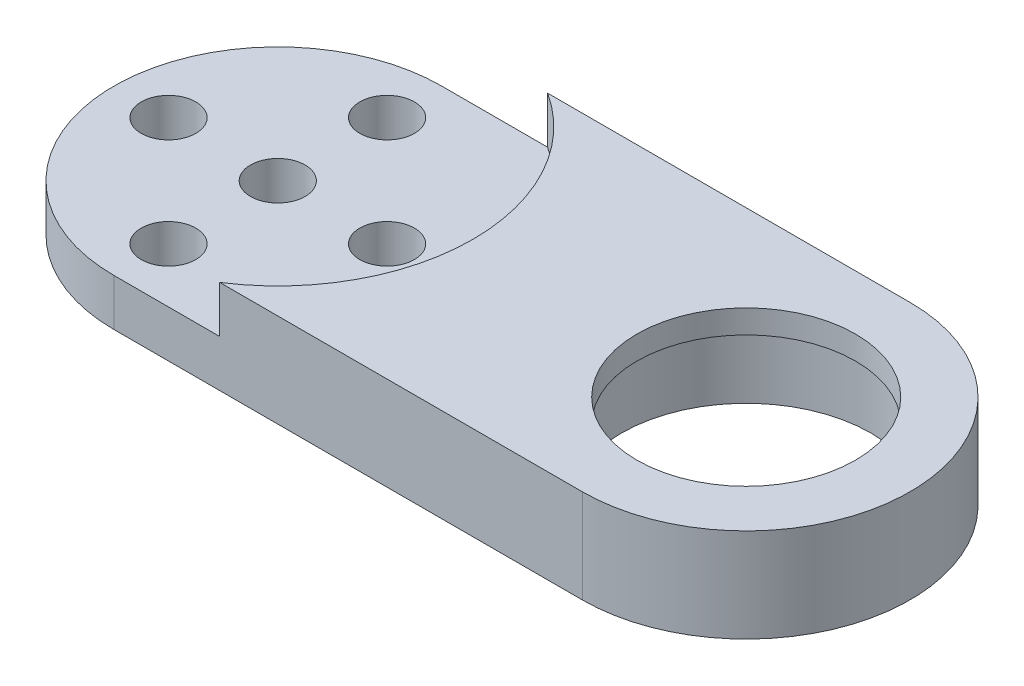
ISO-10303-21;
HEADER;
FILE_DESCRIPTION(('STEP AP214'),'2;1');
FILE_NAME('part.step','',(''),(''),'','','');
FILE_SCHEMA(('AUTOMOTIVE_DESIGN { 1 0 10303 214 1 1 1 1 }'));
ENDSEC;
DATA;
#1=APPLICATION_CONTEXT('core data for automotive mechanical design processes');
#2=APPLICATION_PROTOCOL_DEFINITION('international standard','automotive_design',2000,#1);
#3=PRODUCT_CONTEXT('',#1,'mechanical');
#4=PRODUCT('Part','Part','',(#3));
#5=PRODUCT_RELATED_PRODUCT_CATEGORY('part','',(#4));
#6=PRODUCT_DEFINITION_FORMATION('','',#4);
#7=PRODUCT_DEFINITION_CONTEXT('part definition',#1,'design');
#8=PRODUCT_DEFINITION('design','',#6,#7);
#9=PRODUCT_DEFINITION_SHAPE('','',#8);
#10=(LENGTH_UNIT() NAMED_UNIT(*) SI_UNIT(.MILLI.,.METRE.));
#11=(NAMED_UNIT(*) PLANE_ANGLE_UNIT() SI_UNIT($,.RADIAN.));
#12=(NAMED_UNIT(*) SI_UNIT($,.STERADIAN.) SOLID_ANGLE_UNIT());
#13=UNCERTAINTY_MEASURE_WITH_UNIT(LENGTH_MEASURE(1.E-05),#10,'distance_accuracy_value','');
#14=(GEOMETRIC_REPRESENTATION_CONTEXT(3) GLOBAL_UNCERTAINTY_ASSIGNED_CONTEXT((#13)) GLOBAL_UNIT_ASSIGNED_CONTEXT((#10,
#11,#12)) REPRESENTATION_CONTEXT('',''));
#15=CARTESIAN_POINT('',(0.,0.,0.));
#16=DIRECTION('',(0.,0.,1.));
#17=DIRECTION('',(1.,0.,0.));
#18=AXIS2_PLACEMENT_3D('',#15,#16,#17);
#19=CARTESIAN_POINT('',(-15.,6.,0.));
#20=DIRECTION('',(0.,-1.,0.));
#21=DIRECTION('',(0.,0.,-1.));
#22=AXIS2_PLACEMENT_3D('',#19,#20,#21);
#23=CYLINDRICAL_SURFACE('',#22,10.5);
#24=CARTESIAN_POINT('',(-15.,3.,0.));
#25=DIRECTION('',(0.,1.,0.));
#26=DIRECTION('',(0.,0.,1.));
#27=AXIS2_PLACEMENT_3D('',#24,#25,#26);
#28=CIRCLE('',#27,10.5);
#29=CARTESIAN_POINT('',(-15.,3.,-10.5));
#30=VERTEX_POINT('',#29);
#31=CARTESIAN_POINT('',(-15.,3.,10.5));
#32=VERTEX_POINT('',#31);
#33=EDGE_CURVE('E135',#30,#32,#28,.T.);
#34=ORIENTED_EDGE('',*,*,#33,.F.);
#35=DIRECTION('',(0.,-1.,0.));
#36=VECTOR('',#35,1.);
#37=CARTESIAN_POINT('',(-15.,6.,-10.5));
#38=LINE('',#37,#36);
#39=CARTESIAN_POINT('',(-15.,0.,-10.5));
#40=VERTEX_POINT('',#39);
#41=EDGE_CURVE('E55',#30,#40,#38,.T.);
#42=ORIENTED_EDGE('',*,*,#41,.T.);
#43=CARTESIAN_POINT('',(-15.,0.,0.));
#44=DIRECTION('',(0.,1.,0.));
#45=DIRECTION('',(0.,0.,1.));
#46=AXIS2_PLACEMENT_3D('',#43,#44,#45);
#47=CIRCLE('',#46,10.5);
#48=CARTESIAN_POINT('',(-15.,0.,10.5));
#49=VERTEX_POINT('',#48);
#50=EDGE_CURVE('E103',#40,#49,#47,.T.);
#51=ORIENTED_EDGE('',*,*,#50,.T.);
#52=DIRECTION('',(0.,-1.,0.));
#53=VECTOR('',#52,1.);
#54=CARTESIAN_POINT('',(-15.,6.,10.5));
#55=LINE('',#54,#53);
#56=EDGE_CURVE('E96',#32,#49,#55,.T.);
#57=ORIENTED_EDGE('',*,*,#56,.F.);
#58=EDGE_LOOP('',(#34,#42,#51,#57));
#59=FACE_BOUND('',#58,.T.);
#60=ADVANCED_FACE('F45',(#59),#23,.T.);
#61=CARTESIAN_POINT('',(-15.,0.,0.));
#62=DIRECTION('',(0.,1.,0.));
#63=DIRECTION('',(0.,0.,1.));
#64=AXIS2_PLACEMENT_3D('',#61,#62,#63);
#65=CYLINDRICAL_SURFACE('',#64,1.75);
#66=CARTESIAN_POINT('',(-15.,0.,0.));
#67=DIRECTION('',(0.,1.,0.));
#68=DIRECTION('',(0.,0.,1.));
#69=AXIS2_PLACEMENT_3D('',#66,#67,#68);
#70=CIRCLE('',#69,1.75);
#71=CARTESIAN_POINT('',(-15.,0.,1.75));
#72=VERTEX_POINT('',#71);
#73=EDGE_CURVE('E115',#72,#72,#70,.T.);
#74=ORIENTED_EDGE('',*,*,#73,.F.);
#75=EDGE_LOOP('',(#74));
#76=FACE_BOUND('',#75,.T.);
#77=CARTESIAN_POINT('',(-15.,3.,0.));
#78=DIRECTION('',(0.,1.,0.));
#79=DIRECTION('',(0.,0.,1.));
#80=AXIS2_PLACEMENT_3D('',#77,#78,#79);
#81=CIRCLE('',#80,1.75);
#82=CARTESIAN_POINT('',(-15.,3.,1.75));
#83=VERTEX_POINT('',#82);
#84=EDGE_CURVE('E187',#83,#83,#81,.F.);
#85=ORIENTED_EDGE('',*,*,#84,.F.);
#86=EDGE_LOOP('',(#85));
#87=FACE_BOUND('',#86,.T.);
#88=ADVANCED_FACE('F253',(#76,#87),#65,.F.);
#89=CARTESIAN_POINT('',(-15.,0.,-6.99999999999999));
#90=DIRECTION('',(0.,1.,0.));
#91=DIRECTION('',(0.,0.,1.));
#92=AXIS2_PLACEMENT_3D('',#89,#90,#91);
#93=CYLINDRICAL_SURFACE('',#92,1.75);
#94=CARTESIAN_POINT('',(-15.,0.,-6.99999999999999));
#95=DIRECTION('',(0.,1.,0.));
#96=DIRECTION('',(0.,0.,1.));
#97=AXIS2_PLACEMENT_3D('',#94,#95,#96);
#98=CIRCLE('',#97,1.75);
#99=CARTESIAN_POINT('',(-15.,0.,-5.24999999999999));
#100=VERTEX_POINT('',#99);
#101=EDGE_CURVE('E158',#100,#100,#98,.T.);
#102=ORIENTED_EDGE('',*,*,#101,.F.);
#103=EDGE_LOOP('',(#102));
#104=FACE_BOUND('',#103,.T.);
#105=CARTESIAN_POINT('',(-15.,3.,-6.99999999999999));
#106=DIRECTION('',(0.,1.,0.));
#107=DIRECTION('',(0.,0.,1.));
#108=AXIS2_PLACEMENT_3D('',#105,#106,#107);
#109=CIRCLE('',#108,1.75);
#110=CARTESIAN_POINT('',(-15.,3.,-5.24999999999999));
#111=VERTEX_POINT('',#110);
#112=EDGE_CURVE('E191',#111,#111,#109,.F.);
#113=ORIENTED_EDGE('',*,*,#112,.F.);
#114=EDGE_LOOP('',(#113));
#115=FACE_BOUND('',#114,.T.);
#116=ADVANCED_FACE('F256',(#104,#115),#93,.F.);
#117=CARTESIAN_POINT('',(-22.,0.,0.));
#118=DIRECTION('',(0.,1.,0.));
#119=DIRECTION('',(0.,0.,1.));
#120=AXIS2_PLACEMENT_3D('',#117,#118,#119);
#121=CYLINDRICAL_SURFACE('',#120,1.75);
#122=CARTESIAN_POINT('',(-22.,0.,0.));
#123=DIRECTION('',(0.,1.,0.));
#124=DIRECTION('',(0.,0.,1.));
#125=AXIS2_PLACEMENT_3D('',#122,#123,#124);
#126=CIRCLE('',#125,1.75);
#127=CARTESIAN_POINT('',(-22.,0.,1.75000000000002));
#128=VERTEX_POINT('',#127);
#129=EDGE_CURVE('E154',#128,#128,#126,.T.);
#130=ORIENTED_EDGE('',*,*,#129,.F.);
#131=EDGE_LOOP('',(#130));
#132=FACE_BOUND('',#131,.T.);
#133=CARTESIAN_POINT('',(-22.,3.,0.));
#134=DIRECTION('',(0.,1.,0.));
#135=DIRECTION('',(0.,0.,1.));
#136=AXIS2_PLACEMENT_3D('',#133,#134,#135);
#137=CIRCLE('',#136,1.75);
#138=CARTESIAN_POINT('',(-22.,3.,1.75000000000002));
#139=VERTEX_POINT('',#138);
#140=EDGE_CURVE('E195',#139,#139,#137,.F.);
#141=ORIENTED_EDGE('',*,*,#140,.F.);
#142=EDGE_LOOP('',(#141));
#143=FACE_BOUND('',#142,.T.);
#144=ADVANCED_FACE('F304',(#132,#143),#121,.F.);
#145=CARTESIAN_POINT('',(-15.,0.,7.));
#146=DIRECTION('',(0.,1.,0.));
#147=DIRECTION('',(0.,0.,1.));
#148=AXIS2_PLACEMENT_3D('',#145,#146,#147);
#149=CYLINDRICAL_SURFACE('',#148,1.75);
#150=CARTESIAN_POINT('',(-15.,0.,7.));
#151=DIRECTION('',(0.,1.,0.));
#152=DIRECTION('',(0.,0.,1.));
#153=AXIS2_PLACEMENT_3D('',#150,#151,#152);
#154=CIRCLE('',#153,1.75);
#155=CARTESIAN_POINT('',(-15.,0.,8.75));
#156=VERTEX_POINT('',#155);
#157=EDGE_CURVE('E150',#156,#156,#154,.T.);
#158=ORIENTED_EDGE('',*,*,#157,.F.);
#159=EDGE_LOOP('',(#158));
#160=FACE_BOUND('',#159,.T.);
#161=CARTESIAN_POINT('',(-15.,3.,7.));
#162=DIRECTION('',(0.,1.,0.));
#163=DIRECTION('',(0.,0.,1.));
#164=AXIS2_PLACEMENT_3D('',#161,#162,#163);
#165=CIRCLE('',#164,1.75);
#166=CARTESIAN_POINT('',(-15.,3.,8.75));
#167=VERTEX_POINT('',#166);
#168=EDGE_CURVE('E199',#167,#167,#165,.F.);
#169=ORIENTED_EDGE('',*,*,#168,.F.);
#170=EDGE_LOOP('',(#169));
#171=FACE_BOUND('',#170,.T.);
#172=ADVANCED_FACE('F298',(#160,#171),#149,.F.);
#173=CARTESIAN_POINT('',(-8.,0.,0.));
#174=DIRECTION('',(0.,1.,0.));
#175=DIRECTION('',(0.,0.,1.));
#176=AXIS2_PLACEMENT_3D('',#173,#174,#175);
#177=CYLINDRICAL_SURFACE('',#176,1.75);
#178=CARTESIAN_POINT('',(-8.,0.,0.));
#179=DIRECTION('',(0.,1.,0.));
#180=DIRECTION('',(0.,0.,1.));
#181=AXIS2_PLACEMENT_3D('',#178,#179,#180);
#182=CIRCLE('',#181,1.75);
#183=CARTESIAN_POINT('',(-8.,0.,1.74999999999999));
#184=VERTEX_POINT('',#183);
#185=EDGE_CURVE('E121',#184,#184,#182,.T.);
#186=ORIENTED_EDGE('',*,*,#185,.F.);
#187=EDGE_LOOP('',(#186));
#188=FACE_BOUND('',#187,.T.);
#189=CARTESIAN_POINT('',(-8.,3.,0.));
#190=DIRECTION('',(0.,1.,0.));
#191=DIRECTION('',(0.,0.,1.));
#192=AXIS2_PLACEMENT_3D('',#189,#190,#191);
#193=CIRCLE('',#192,1.75);
#194=CARTESIAN_POINT('',(-8.,3.,1.74999999999999));
#195=VERTEX_POINT('',#194);
#196=EDGE_CURVE('E49',#195,#195,#193,.F.);
#197=ORIENTED_EDGE('',*,*,#196,.F.);
#198=EDGE_LOOP('',(#197));
#199=FACE_BOUND('',#198,.T.);
#200=ADVANCED_FACE('F295',(#188,#199),#177,.F.);
#201=CARTESIAN_POINT('',(15.,6.,0.));
#202=DIRECTION('',(0.,-1.,0.));
#203=DIRECTION('',(0.,0.,-1.));
#204=AXIS2_PLACEMENT_3D('',#201,#202,#203);
#205=CYLINDRICAL_SURFACE('',#204,10.5);
#206=CARTESIAN_POINT('',(15.,0.,0.));
#207=DIRECTION('',(0.,1.,0.));
#208=DIRECTION('',(0.,0.,-1.));
#209=AXIS2_PLACEMENT_3D('',#206,#207,#208);
#210=CIRCLE('',#209,10.5);
#211=CARTESIAN_POINT('',(15.,0.,10.5));
#212=VERTEX_POINT('',#211);
#213=CARTESIAN_POINT('',(15.,0.,-10.5));
#214=VERTEX_POINT('',#213);
#215=EDGE_CURVE('E108',#212,#214,#210,.T.);
#216=ORIENTED_EDGE('',*,*,#215,.T.);
#217=DIRECTION('',(0.,-1.,0.));
#218=VECTOR('',#217,1.);
#219=CARTESIAN_POINT('',(15.,6.,-10.5));
#220=LINE('',#219,#218);
#221=CARTESIAN_POINT('',(15.,6.,-10.5));
#222=VERTEX_POINT('',#221);
#223=EDGE_CURVE('E11',#222,#214,#220,.T.);
#224=ORIENTED_EDGE('',*,*,#223,.F.);
#225=CARTESIAN_POINT('',(15.,6.,0.));
#226=DIRECTION('',(0.,1.,0.));
#227=DIRECTION('',(0.,0.,-1.));
#228=AXIS2_PLACEMENT_3D('',#225,#226,#227);
#229=CIRCLE('',#228,10.5);
#230=CARTESIAN_POINT('',(15.,6.,10.5));
#231=VERTEX_POINT('',#230);
#232=EDGE_CURVE('E102',#231,#222,#229,.T.);
#233=ORIENTED_EDGE('',*,*,#232,.F.);
#234=DIRECTION('',(0.,-1.,0.));
#235=VECTOR('',#234,1.);
#236=CARTESIAN_POINT('',(15.,6.,10.5));
#237=LINE('',#236,#235);
#238=EDGE_CURVE('E92',#231,#212,#237,.T.);
#239=ORIENTED_EDGE('',*,*,#238,.T.);
#240=EDGE_LOOP('',(#216,#224,#233,#239));
#241=FACE_BOUND('',#240,.T.);
#242=ADVANCED_FACE('F47',(#241),#205,.T.);
#243=CARTESIAN_POINT('',(15.,6.,-10.5));
#244=DIRECTION('',(0.,0.,1.));
#245=DIRECTION('',(1.,0.,0.));
#246=AXIS2_PLACEMENT_3D('',#243,#244,#245);
#247=PLANE('',#246);
#248=DIRECTION('',(-1.,0.,0.));
#249=VECTOR('',#248,1.);
#250=CARTESIAN_POINT('',(15.,3.,-10.5));
#251=LINE('',#250,#249);
#252=CARTESIAN_POINT('',(-8.21767001687473,3.,-10.5));
#253=VERTEX_POINT('',#252);
#254=EDGE_CURVE('E177',#253,#30,#251,.T.);
#255=ORIENTED_EDGE('',*,*,#254,.F.);
#256=DIRECTION('',(0.,1.,0.));
#257=VECTOR('',#256,1.);
#258=CARTESIAN_POINT('',(-8.21767001687473,3.,-10.5));
#259=LINE('',#258,#257);
#260=CARTESIAN_POINT('',(-8.21767001687473,6.,-10.5));
#261=VERTEX_POINT('',#260);
#262=EDGE_CURVE('E144',#253,#261,#259,.T.);
#263=ORIENTED_EDGE('',*,*,#262,.T.);
#264=DIRECTION('',(-1.,0.,0.));
#265=VECTOR('',#264,1.);
#266=CARTESIAN_POINT('',(15.,6.,-10.5));
#267=LINE('',#266,#265);
#268=EDGE_CURVE('E141',#222,#261,#267,.T.);
#269=ORIENTED_EDGE('',*,*,#268,.F.);
#270=ORIENTED_EDGE('',*,*,#223,.T.);
#271=DIRECTION('',(-1.,0.,0.));
#272=VECTOR('',#271,1.);
#273=CARTESIAN_POINT('',(15.,0.,-10.5));
#274=LINE('',#273,#272);
#275=EDGE_CURVE('E113',#214,#40,#274,.T.);
#276=ORIENTED_EDGE('',*,*,#275,.T.);
#277=ORIENTED_EDGE('',*,*,#41,.F.);
#278=EDGE_LOOP('',(#255,#263,#269,#270,#276,#277));
#279=FACE_BOUND('',#278,.T.);
#280=ADVANCED_FACE('F138',(#279),#247,.F.);
#281=CARTESIAN_POINT('',(15.,6.,10.5));
#282=DIRECTION('',(0.,0.,-1.));
#283=DIRECTION('',(-1.,0.,0.));
#284=AXIS2_PLACEMENT_3D('',#281,#282,#283);
#285=PLANE('',#284);
#286=DIRECTION('',(1.,0.,0.));
#287=VECTOR('',#286,1.);
#288=CARTESIAN_POINT('',(15.,6.,10.5));
#289=LINE('',#288,#287);
#290=CARTESIAN_POINT('',(-8.21767001687473,6.,10.5));
#291=VERTEX_POINT('',#290);
#292=EDGE_CURVE('E70',#291,#231,#289,.T.);
#293=ORIENTED_EDGE('',*,*,#292,.F.);
#294=DIRECTION('',(0.,1.,0.));
#295=VECTOR('',#294,1.);
#296=CARTESIAN_POINT('',(-8.21767001687473,3.,10.5));
#297=LINE('',#296,#295);
#298=CARTESIAN_POINT('',(-8.21767001687473,3.,10.5));
#299=VERTEX_POINT('',#298);
#300=EDGE_CURVE('E62',#291,#299,#297,.F.);
#301=ORIENTED_EDGE('',*,*,#300,.T.);
#302=DIRECTION('',(1.,0.,0.));
#303=VECTOR('',#302,1.);
#304=CARTESIAN_POINT('',(15.,3.,10.5));
#305=LINE('',#304,#303);
#306=EDGE_CURVE('E183',#32,#299,#305,.T.);
#307=ORIENTED_EDGE('',*,*,#306,.F.);
#308=ORIENTED_EDGE('',*,*,#56,.T.);
#309=DIRECTION('',(1.,0.,0.));
#310=VECTOR('',#309,1.);
#311=CARTESIAN_POINT('',(15.,0.,10.5));
#312=LINE('',#311,#310);
#313=EDGE_CURVE('E89',#49,#212,#312,.T.);
#314=ORIENTED_EDGE('',*,*,#313,.T.);
#315=ORIENTED_EDGE('',*,*,#238,.F.);
#316=EDGE_LOOP('',(#293,#301,#307,#308,#314,#315));
#317=FACE_BOUND('',#316,.T.);
#318=ADVANCED_FACE('F91',(#317),#285,.F.);
#319=CARTESIAN_POINT('',(15.,6.,0.));
#320=DIRECTION('',(0.,-1.,0.));
#321=DIRECTION('',(0.,0.,-1.));
#322=AXIS2_PLACEMENT_3D('',#319,#320,#321);
#323=PLANE('',#322);
#324=CARTESIAN_POINT('',(15.,6.,0.));
#325=DIRECTION('',(0.,-1.,0.));
#326=DIRECTION('',(0.,0.,-1.));
#327=AXIS2_PLACEMENT_3D('',#324,#325,#326);
#328=CIRCLE('',#327,7.);
#329=CARTESIAN_POINT('',(15.,6.,-7.00000000000001));
#330=VERTEX_POINT('',#329);
#331=EDGE_CURVE('E207',#330,#330,#328,.T.);
#332=ORIENTED_EDGE('',*,*,#331,.T.);
#333=EDGE_LOOP('',(#332));
#334=FACE_BOUND('',#333,.T.);
#335=ORIENTED_EDGE('',*,*,#268,.T.);
#336=CARTESIAN_POINT('',(-15.,6.,0.));
#337=DIRECTION('',(0.,1.,0.));
#338=DIRECTION('',(0.,0.,1.));
#339=AXIS2_PLACEMENT_3D('',#336,#337,#338);
#340=CIRCLE('',#339,12.5);
#341=EDGE_CURVE('E203',#291,#261,#340,.T.);
#342=ORIENTED_EDGE('',*,*,#341,.F.);
#343=ORIENTED_EDGE('',*,*,#292,.T.);
#344=ORIENTED_EDGE('',*,*,#232,.T.);
#345=EDGE_LOOP('',(#335,#342,#343,#344));
#346=FACE_BOUND('',#345,.T.);
#347=ADVANCED_FACE('F146',(#334,#346),#323,.F.);
#348=CARTESIAN_POINT('',(15.,0.,0.));
#349=DIRECTION('',(0.,-1.,0.));
#350=DIRECTION('',(0.,0.,-1.));
#351=AXIS2_PLACEMENT_3D('',#348,#349,#350);
#352=PLANE('',#351);
#353=CARTESIAN_POINT('',(15.,0.,0.));
#354=DIRECTION('',(0.,-1.,0.));
#355=DIRECTION('',(0.,0.,-1.));
#356=AXIS2_PLACEMENT_3D('',#353,#354,#355);
#357=CIRCLE('',#356,8.);
#358=CARTESIAN_POINT('',(15.,0.,-8.00000000000001));
#359=VERTEX_POINT('',#358);
#360=EDGE_CURVE('E166',#359,#359,#357,.T.);
#361=ORIENTED_EDGE('',*,*,#360,.F.);
#362=EDGE_LOOP('',(#361));
#363=FACE_BOUND('',#362,.T.);
#364=ORIENTED_EDGE('',*,*,#185,.T.);
#365=EDGE_LOOP('',(#364));
#366=FACE_BOUND('',#365,.T.);
#367=ORIENTED_EDGE('',*,*,#157,.T.);
#368=EDGE_LOOP('',(#367));
#369=FACE_BOUND('',#368,.T.);
#370=ORIENTED_EDGE('',*,*,#129,.T.);
#371=EDGE_LOOP('',(#370));
#372=FACE_BOUND('',#371,.T.);
#373=ORIENTED_EDGE('',*,*,#101,.T.);
#374=EDGE_LOOP('',(#373));
#375=FACE_BOUND('',#374,.T.);
#376=ORIENTED_EDGE('',*,*,#73,.T.);
#377=EDGE_LOOP('',(#376));
#378=FACE_BOUND('',#377,.T.);
#379=ORIENTED_EDGE('',*,*,#215,.F.);
#380=ORIENTED_EDGE('',*,*,#313,.F.);
#381=ORIENTED_EDGE('',*,*,#50,.F.);
#382=ORIENTED_EDGE('',*,*,#275,.F.);
#383=EDGE_LOOP('',(#379,#380,#381,#382));
#384=FACE_BOUND('',#383,.T.);
#385=ADVANCED_FACE('F111',(#363,#366,#369,#372,#375,#378,#384),#352,.T.);
#386=CARTESIAN_POINT('',(15.,4.5,0.));
#387=DIRECTION('',(0.,-1.,0.));
#388=DIRECTION('',(0.,0.,-1.));
#389=AXIS2_PLACEMENT_3D('',#386,#387,#388);
#390=CYLINDRICAL_SURFACE('',#389,8.);
#391=CARTESIAN_POINT('',(15.,4.5,0.));
#392=DIRECTION('',(0.,-1.,0.));
#393=DIRECTION('',(0.,0.,-1.));
#394=AXIS2_PLACEMENT_3D('',#391,#392,#393);
#395=CIRCLE('',#394,8.);
#396=CARTESIAN_POINT('',(15.,4.5,-8.00000000000001));
#397=VERTEX_POINT('',#396);
#398=EDGE_CURVE('E162',#397,#397,#395,.T.);
#399=ORIENTED_EDGE('',*,*,#398,.F.);
#400=EDGE_LOOP('',(#399));
#401=FACE_BOUND('',#400,.T.);
#402=ORIENTED_EDGE('',*,*,#360,.T.);
#403=EDGE_LOOP('',(#402));
#404=FACE_BOUND('',#403,.T.);
#405=ADVANCED_FACE('F231',(#401,#404),#390,.F.);
#406=CARTESIAN_POINT('',(15.,4.5,0.));
#407=DIRECTION('',(0.,-1.,0.));
#408=DIRECTION('',(0.,0.,-1.));
#409=AXIS2_PLACEMENT_3D('',#406,#407,#408);
#410=PLANE('',#409);
#411=CARTESIAN_POINT('',(15.,4.5,0.));
#412=DIRECTION('',(0.,-1.,0.));
#413=DIRECTION('',(0.,0.,-1.));
#414=AXIS2_PLACEMENT_3D('',#411,#412,#413);
#415=CIRCLE('',#414,7.);
#416=CARTESIAN_POINT('',(15.,4.5,-7.00000000000001));
#417=VERTEX_POINT('',#416);
#418=EDGE_CURVE('E211',#417,#417,#415,.T.);
#419=ORIENTED_EDGE('',*,*,#418,.F.);
#420=EDGE_LOOP('',(#419));
#421=FACE_BOUND('',#420,.T.);
#422=ORIENTED_EDGE('',*,*,#398,.T.);
#423=EDGE_LOOP('',(#422));
#424=FACE_BOUND('',#423,.T.);
#425=ADVANCED_FACE('F227',(#421,#424),#410,.T.);
#426=CARTESIAN_POINT('',(-15.,3.,0.));
#427=DIRECTION('',(0.,1.,0.));
#428=DIRECTION('',(0.,0.,1.));
#429=AXIS2_PLACEMENT_3D('',#426,#427,#428);
#430=CYLINDRICAL_SURFACE('',#429,12.5);
#431=CARTESIAN_POINT('',(-15.,3.,0.));
#432=DIRECTION('',(0.,1.,0.));
#433=DIRECTION('',(0.,0.,1.));
#434=AXIS2_PLACEMENT_3D('',#431,#432,#433);
#435=CIRCLE('',#434,12.5);
#436=EDGE_CURVE('E206',#299,#253,#435,.T.);
#437=ORIENTED_EDGE('',*,*,#436,.F.);
#438=ORIENTED_EDGE('',*,*,#300,.F.);
#439=ORIENTED_EDGE('',*,*,#341,.T.);
#440=ORIENTED_EDGE('',*,*,#262,.F.);
#441=EDGE_LOOP('',(#437,#438,#439,#440));
#442=FACE_BOUND('',#441,.T.);
#443=ADVANCED_FACE('F230',(#442),#430,.F.);
#444=CARTESIAN_POINT('',(-15.,3.,0.));
#445=DIRECTION('',(0.,1.,0.));
#446=DIRECTION('',(0.,0.,1.));
#447=AXIS2_PLACEMENT_3D('',#444,#445,#446);
#448=PLANE('',#447);
#449=ORIENTED_EDGE('',*,*,#84,.T.);
#450=EDGE_LOOP('',(#449));
#451=FACE_BOUND('',#450,.T.);
#452=ORIENTED_EDGE('',*,*,#112,.T.);
#453=EDGE_LOOP('',(#452));
#454=FACE_BOUND('',#453,.T.);
#455=ORIENTED_EDGE('',*,*,#140,.T.);
#456=EDGE_LOOP('',(#455));
#457=FACE_BOUND('',#456,.T.);
#458=ORIENTED_EDGE('',*,*,#168,.T.);
#459=EDGE_LOOP('',(#458));
#460=FACE_BOUND('',#459,.T.);
#461=ORIENTED_EDGE('',*,*,#196,.T.);
#462=EDGE_LOOP('',(#461));
#463=FACE_BOUND('',#462,.T.);
#464=ORIENTED_EDGE('',*,*,#254,.T.);
#465=ORIENTED_EDGE('',*,*,#33,.T.);
#466=ORIENTED_EDGE('',*,*,#306,.T.);
#467=ORIENTED_EDGE('',*,*,#436,.T.);
#468=EDGE_LOOP('',(#464,#465,#466,#467));
#469=FACE_BOUND('',#468,.T.);
#470=ADVANCED_FACE('F223',(#451,#454,#457,#460,#463,#469),#448,.T.);
#471=CARTESIAN_POINT('',(15.,6.,0.));
#472=DIRECTION('',(0.,-1.,0.));
#473=DIRECTION('',(0.,0.,-1.));
#474=AXIS2_PLACEMENT_3D('',#471,#472,#473);
#475=CYLINDRICAL_SURFACE('',#474,7.);
#476=ORIENTED_EDGE('',*,*,#331,.F.);
#477=EDGE_LOOP('',(#476));
#478=FACE_BOUND('',#477,.T.);
#479=ORIENTED_EDGE('',*,*,#418,.T.);
#480=EDGE_LOOP('',(#479));
#481=FACE_BOUND('',#480,.T.);
#482=ADVANCED_FACE('F220',(#478,#481),#475,.F.);
#483=CLOSED_SHELL('',(#60,#88,#116,#144,#172,#200,#242,#280,#318,#347,#385,#405,#425,#443,#470,#482));
#484=MANIFOLD_SOLID_BREP('B2',#483);
#485=ADVANCED_BREP_SHAPE_REPRESENTATION('',(#18,#484),#14);
#486=SHAPE_DEFINITION_REPRESENTATION(#9,#485);
ENDSEC;
END-ISO-10303-21;
